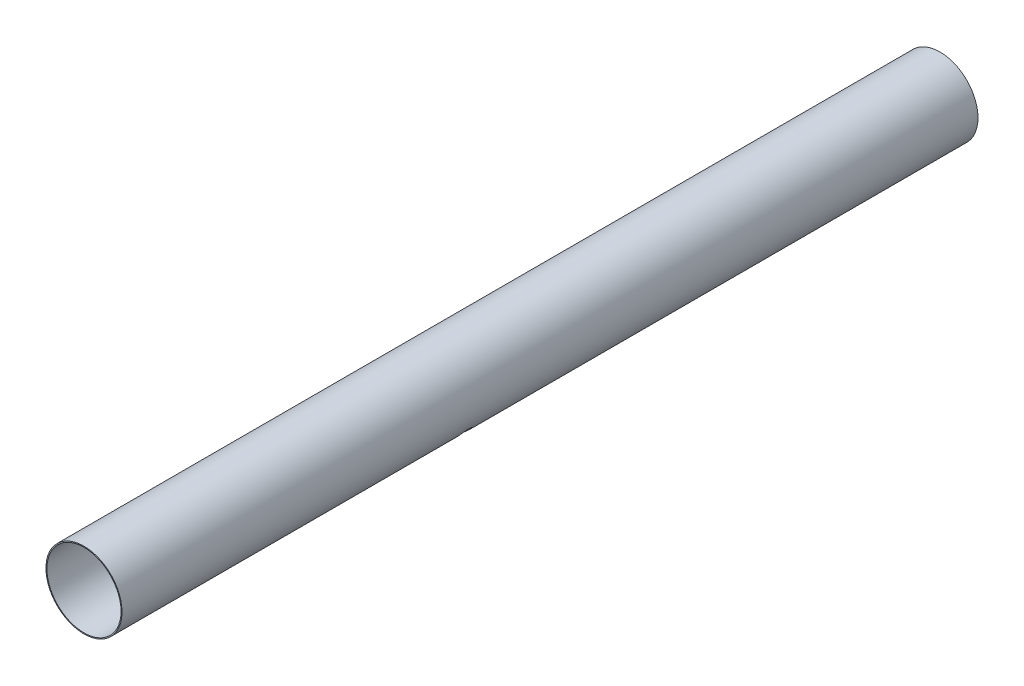
ISO-10303-21;
HEADER;
FILE_DESCRIPTION(('STEP AP214'),'2;1');
FILE_NAME('part.step','',(''),(''),'','','');
FILE_SCHEMA(('AUTOMOTIVE_DESIGN { 1 0 10303 214 1 1 1 1 }'));
ENDSEC;
DATA;
#1=APPLICATION_CONTEXT('core data for automotive mechanical design processes');
#2=APPLICATION_PROTOCOL_DEFINITION('international standard','automotive_design',2000,#1);
#3=PRODUCT_CONTEXT('',#1,'mechanical');
#4=PRODUCT('Part','Part','',(#3));
#5=PRODUCT_RELATED_PRODUCT_CATEGORY('part','',(#4));
#6=PRODUCT_DEFINITION_FORMATION('','',#4);
#7=PRODUCT_DEFINITION_CONTEXT('part definition',#1,'design');
#8=PRODUCT_DEFINITION('design','',#6,#7);
#9=PRODUCT_DEFINITION_SHAPE('','',#8);
#10=(LENGTH_UNIT() NAMED_UNIT(*) SI_UNIT(.MILLI.,.METRE.));
#11=(NAMED_UNIT(*) PLANE_ANGLE_UNIT() SI_UNIT($,.RADIAN.));
#12=(NAMED_UNIT(*) SI_UNIT($,.STERADIAN.) SOLID_ANGLE_UNIT());
#13=UNCERTAINTY_MEASURE_WITH_UNIT(LENGTH_MEASURE(1.E-05),#10,'distance_accuracy_value','');
#14=(GEOMETRIC_REPRESENTATION_CONTEXT(3) GLOBAL_UNCERTAINTY_ASSIGNED_CONTEXT((#13)) GLOBAL_UNIT_ASSIGNED_CONTEXT((#10,
#11,#12)) REPRESENTATION_CONTEXT('',''));
#15=CARTESIAN_POINT('',(0.,0.,0.));
#16=DIRECTION('',(0.,0.,1.));
#17=DIRECTION('',(1.,0.,0.));
#18=AXIS2_PLACEMENT_3D('',#15,#16,#17);
#19=CARTESIAN_POINT('',(0.,0.,1760.));
#20=DIRECTION('',(0.,0.,-1.));
#21=DIRECTION('',(-1.,0.,0.));
#22=AXIS2_PLACEMENT_3D('',#19,#20,#21);
#23=CYLINDRICAL_SURFACE('',#22,78.2);
#24=CARTESIAN_POINT('',(0.,0.,1760.));
#25=DIRECTION('',(0.,0.,1.));
#26=DIRECTION('',(1.,0.,0.));
#27=AXIS2_PLACEMENT_3D('',#24,#25,#26);
#28=CIRCLE('',#27,78.2);
#29=CARTESIAN_POINT('',(78.2,0.,1760.));
#30=VERTEX_POINT('',#29);
#31=EDGE_CURVE('E10',#30,#30,#28,.T.);
#32=ORIENTED_EDGE('',*,*,#31,.F.);
#33=EDGE_LOOP('',(#32));
#34=FACE_BOUND('',#33,.T.);
#35=CARTESIAN_POINT('',(0.,0.,0.));
#36=DIRECTION('',(0.,0.,1.));
#37=DIRECTION('',(1.,0.,0.));
#38=AXIS2_PLACEMENT_3D('',#35,#36,#37);
#39=CIRCLE('',#38,78.2);
#40=CARTESIAN_POINT('',(78.2,0.,0.));
#41=VERTEX_POINT('',#40);
#42=EDGE_CURVE('E44',#41,#41,#39,.T.);
#43=ORIENTED_EDGE('',*,*,#42,.T.);
#44=EDGE_LOOP('',(#43));
#45=FACE_BOUND('',#44,.T.);
#46=CARTESIAN_POINT('',(43.6623581027108,-64.8755615383069,1034.89));
#47=CARTESIAN_POINT('',(43.6623496807628,-64.87556417447,1034.47275989778));
#48=CARTESIAN_POINT('',(43.6770819087763,-64.8656586351443,1034.05561945035));
#49=CARTESIAN_POINT('',(43.7358255801968,-64.8260666382009,1033.22422388497));
#50=CARTESIAN_POINT('',(43.7798421979213,-64.796376684834,1032.80996929));
#51=CARTESIAN_POINT('',(43.8967091385557,-64.7172609974049,1031.98714969527));
#52=CARTESIAN_POINT('',(43.9695812414536,-64.6678203553632,1031.5785892351));
#53=CARTESIAN_POINT('',(44.1433288631546,-64.5493420995531,1030.77037992374));
#54=CARTESIAN_POINT('',(44.2442031969181,-64.4803053150804,1030.37073069621));
#55=CARTESIAN_POINT('',(44.4727348982092,-64.3228968775756,1029.58350136965));
#56=CARTESIAN_POINT('',(44.600366659882,-64.2345437061631,1029.19591013591));
#57=CARTESIAN_POINT('',(44.8811060225703,-64.038703881101,1028.43505287068));
#58=CARTESIAN_POINT('',(45.0342138689332,-63.9312170431841,1028.06178697721));
#59=CARTESIAN_POINT('',(45.3643028091055,-63.6974168228568,1027.33213686961));
#60=CARTESIAN_POINT('',(45.541281671805,-63.5711051997935,1026.97575108198));
#61=CARTESIAN_POINT('',(45.917351991572,-63.3000039166223,1026.28219422909));
#62=CARTESIAN_POINT('',(46.116443609249,-63.1552141223026,1025.94502330341));
#63=CARTESIAN_POINT('',(46.5372573270351,-62.8457847286794,1025.28830895425));
#64=CARTESIAN_POINT('',(46.7592165195771,-62.6809331012947,1024.96901731689));
#65=CARTESIAN_POINT('',(47.2216675217133,-62.3332798299509,1024.35453506863));
#66=CARTESIAN_POINT('',(47.4621594769671,-62.1504780449081,1024.05934464718));
#67=CARTESIAN_POINT('',(47.959452674743,-61.7675429799055,1023.49505433353));
#68=CARTESIAN_POINT('',(48.2162549853749,-61.5674085645779,1023.22595615294));
#69=CARTESIAN_POINT('',(48.7438242728239,-61.1505731261449,1022.71572949519));
#70=CARTESIAN_POINT('',(49.0145912810585,-60.9338720657676,1022.47460108095));
#71=CARTESIAN_POINT('',(49.5699053756379,-60.483000841797,1022.02019952035));
#72=CARTESIAN_POINT('',(49.8545454797172,-60.2487046368343,1021.80716500496));
#73=CARTESIAN_POINT('',(50.4330588808102,-59.7652795967825,1021.41280923167));
#74=CARTESIAN_POINT('',(50.7269322424603,-59.5161506578478,1021.23148819582));
#75=CARTESIAN_POINT('',(51.3213387834939,-59.0043555036575,1020.90194357551));
#76=CARTESIAN_POINT('',(51.6218715181804,-58.7416901907849,1020.75371778829));
#77=CARTESIAN_POINT('',(52.2270506277264,-58.2042860937136,1020.49150366963));
#78=CARTESIAN_POINT('',(52.53169694739,-57.9295474714026,1020.37751487928));
#79=CARTESIAN_POINT('',(53.1388484287782,-57.3730798417388,1020.18585414844));
#80=CARTESIAN_POINT('',(53.4413346503358,-57.0914762799271,1020.10775789659));
#81=CARTESIAN_POINT('',(54.0454375185253,-56.5199395580935,1019.9864817129));
#82=CARTESIAN_POINT('',(54.3470541714818,-56.2300064588248,1019.94330152645));
#83=CARTESIAN_POINT('',(54.9470733323842,-55.6438228900297,1019.89220700689));
#84=CARTESIAN_POINT('',(55.2454760893486,-55.3475729153242,1019.88428992163));
#85=CARTESIAN_POINT('',(55.8368841816495,-54.7508795561989,1019.90377845133));
#86=CARTESIAN_POINT('',(56.1298895555506,-54.4504362017681,1019.9311838138));
#87=CARTESIAN_POINT('',(56.7046409787313,-53.8515893965332,1020.02050363353));
#88=CARTESIAN_POINT('',(56.9864843344896,-53.5532109323121,1020.08196041228));
#89=CARTESIAN_POINT('',(57.5410847147586,-52.9568633689938,1020.23857779726));
#90=CARTESIAN_POINT('',(57.8138418319461,-52.6588942657511,1020.33373805962));
#91=CARTESIAN_POINT('',(58.3486331891633,-52.0656940459295,1020.55703602807));
#92=CARTESIAN_POINT('',(58.6106671633619,-51.7704629973683,1020.68517455115));
#93=CARTESIAN_POINT('',(59.1225461215398,-51.1851123233137,1020.97346865194));
#94=CARTESIAN_POINT('',(59.3723909958543,-50.8949927438228,1021.13362451764));
#95=CARTESIAN_POINT('',(59.8600367045149,-50.3205603579858,1021.48581361921));
#96=CARTESIAN_POINT('',(60.0977584452467,-50.0362915025469,1021.67802802847));
#97=CARTESIAN_POINT('',(60.5584539727404,-49.4777195961244,1022.09228797332));
#98=CARTESIAN_POINT('',(60.7814277254698,-49.2034165681387,1022.31433357776));
#99=CARTESIAN_POINT('',(61.2116924839857,-48.6671031083204,1022.78672657944));
#100=CARTESIAN_POINT('',(61.4189820871721,-48.4050937766808,1023.0370765029));
#101=CARTESIAN_POINT('',(61.8170520730078,-47.8956844365422,1023.56435594999));
#102=CARTESIAN_POINT('',(62.0078322705763,-47.6482845918344,1023.84128577153));
#103=CARTESIAN_POINT('',(62.3751335364172,-47.1664708051701,1024.42452098603));
#104=CARTESIAN_POINT('',(62.551376415579,-46.9323292073347,1024.73122670461));
#105=CARTESIAN_POINT('',(62.885525101432,-46.4836423275914,1025.3680715411));
#106=CARTESIAN_POINT('',(63.0434307021023,-46.2690972658581,1025.69821092223));
#107=CARTESIAN_POINT('',(63.3404112073374,-45.8617037977611,1026.37968196004));
#108=CARTESIAN_POINT('',(63.479485705892,-45.6688558592159,1026.73101407343));
#109=CARTESIAN_POINT('',(63.7383852049995,-45.3068184768503,1027.45246087399));
#110=CARTESIAN_POINT('',(63.8582102773678,-45.1376289447659,1027.82257549109));
#111=CARTESIAN_POINT('',(64.0784723679087,-44.8243921193247,1028.57973638643));
#112=CARTESIAN_POINT('',(64.1788728837374,-44.6803922096652,1028.96681289751));
#113=CARTESIAN_POINT('',(64.3597237984537,-44.4194908597153,1029.75452831024));
#114=CARTESIAN_POINT('',(64.4401741362848,-44.3025895023585,1030.1551672534));
#115=CARTESIAN_POINT('',(64.5808909992508,-44.0972111268771,1030.96709430306));
#116=CARTESIAN_POINT('',(64.6411594917881,-44.008731338145,1031.37838136733));
#117=CARTESIAN_POINT('',(64.7413526508136,-43.8612040873241,1032.20863977332));
#118=CARTESIAN_POINT('',(64.7812776165333,-43.8021561923239,1032.62761100192));
#119=CARTESIAN_POINT('',(64.8402030253023,-43.7148807600576,1033.46349275942));
#120=CARTESIAN_POINT('',(64.8595235266004,-43.6861818593776,1033.88033158609));
#121=CARTESIAN_POINT('',(64.878295844346,-43.6582983604818,1034.71543963088));
#122=CARTESIAN_POINT('',(64.8777478684865,-43.6591134537443,1035.133708834));
#123=CARTESIAN_POINT('',(64.8567855746268,-43.6902473469971,1035.96862623638));
#124=CARTESIAN_POINT('',(64.8363722258371,-43.7205647076028,1036.38527451373));
#125=CARTESIAN_POINT('',(64.7757369990457,-43.8103506439682,1037.21396115566));
#126=CARTESIAN_POINT('',(64.735515158247,-43.8698191649781,1037.6259995289));
#127=CARTESIAN_POINT('',(64.6358112956779,-44.01658417737,1038.43894998519));
#128=CARTESIAN_POINT('',(64.5765004272744,-44.1036332755727,1038.83992778759));
#129=CARTESIAN_POINT('',(64.4386833373251,-44.3047507057611,1039.63167193173));
#130=CARTESIAN_POINT('',(64.3601772616886,-44.4188188323656,1040.02243835107));
#131=CARTESIAN_POINT('',(64.1841746111753,-44.6727610255715,1040.79111910652));
#132=CARTESIAN_POINT('',(64.0866769238404,-44.8126366038522,1041.16903268823));
#133=CARTESIAN_POINT('',(63.8729557895324,-45.1167378844695,1041.90945330335));
#134=CARTESIAN_POINT('',(63.7567321105489,-45.2809638884999,1042.2719601458));
#135=CARTESIAN_POINT('',(63.5043651436858,-45.6342335864576,1042.98343352619));
#136=CARTESIAN_POINT('',(63.3679987322034,-45.8235524488748,1043.33218430782));
#137=CARTESIAN_POINT('',(63.0768080154148,-46.223559654435,1044.00911694176));
#138=CARTESIAN_POINT('',(62.9219835840321,-46.4342481435408,1044.33729865354));
#139=CARTESIAN_POINT('',(62.5943366308358,-46.8749869835518,1044.97093309118));
#140=CARTESIAN_POINT('',(62.4215126208906,-47.105038935047,1045.27638393417));
#141=CARTESIAN_POINT('',(62.0584426754033,-47.5823452797119,1045.86248668616));
#142=CARTESIAN_POINT('',(61.8681966055957,-47.8295998054521,1046.143138404));
#143=CARTESIAN_POINT('',(61.4681647678749,-48.342651821325,1046.68150533538));
#144=CARTESIAN_POINT('',(61.2581419883568,-48.6086610591357,1046.93884281606));
#145=CARTESIAN_POINT('',(60.8217165364081,-49.1536432435658,1047.42424645946));
#146=CARTESIAN_POINT('',(60.5953136899976,-49.4326163278685,1047.65231231121));
#147=CARTESIAN_POINT('',(60.1271365980598,-50.0010298722669,1048.0775125486));
#148=CARTESIAN_POINT('',(59.8853627555737,-50.2904700578201,1048.2746477448));
#149=CARTESIAN_POINT('',(59.3876202511187,-50.8772892565308,1048.6365232127));
#150=CARTESIAN_POINT('',(59.1316517226888,-51.1746681949893,1048.80126378908));
#151=CARTESIAN_POINT('',(58.6083171836306,-51.7731813540944,1049.09628602895));
#152=CARTESIAN_POINT('',(58.3410205319055,-52.0742864531199,1049.22674977037));
#153=CARTESIAN_POINT('',(57.7952947131388,-52.6793114865409,1049.45336914588));
#154=CARTESIAN_POINT('',(57.5168655687122,-52.9832314152172,1049.54952484966));
#155=CARTESIAN_POINT('',(56.9506509721043,-53.5913793372568,1049.70675407274));
#156=CARTESIAN_POINT('',(56.6628663869477,-53.8956072995551,1049.76783083327));
#157=CARTESIAN_POINT('',(56.0798569774786,-54.5019864392952,1049.85441982361));
#158=CARTESIAN_POINT('',(55.7846322438955,-54.8041376420049,1049.87993248689));
#159=CARTESIAN_POINT('',(55.1936321774001,-55.3992419410402,1049.89506413731));
#160=CARTESIAN_POINT('',(54.8979415415809,-55.6922648414889,1049.88525197855));
#161=CARTESIAN_POINT('',(54.3035501764956,-56.2719893048543,1049.83107331168));
#162=CARTESIAN_POINT('',(54.004849481666,-56.5586909399699,1049.78670719845));
#163=CARTESIAN_POINT('',(53.4066983308257,-57.123846842018,1049.66377211014));
#164=CARTESIAN_POINT('',(53.1072478864051,-57.4023012355981,1049.58520366058));
#165=CARTESIAN_POINT('',(52.5099253216726,-57.9492168451592,1049.394475532));
#166=CARTESIAN_POINT('',(52.2120532071426,-58.2176780245541,1049.28231573001));
#167=CARTESIAN_POINT('',(51.6208462643092,-58.7425245568245,1049.0255120382));
#168=CARTESIAN_POINT('',(51.3275037220065,-58.9989324333076,1048.8809319086));
#169=CARTESIAN_POINT('',(50.7471463834094,-59.498855756419,1048.56023704233));
#170=CARTESIAN_POINT('',(50.4601315679278,-59.7423712421433,1048.38412240128));
#171=CARTESIAN_POINT('',(49.8947870887509,-60.2153308933427,1048.00161833156));
#172=CARTESIAN_POINT('',(49.6164578807498,-60.4447743211286,1047.79522731764));
#173=CARTESIAN_POINT('',(49.0708407027146,-60.8885562121565,1047.35362402537));
#174=CARTESIAN_POINT('',(48.8035528652791,-61.1028944940189,1047.11841140103));
#175=CARTESIAN_POINT('',(48.2784167641175,-61.5186827183556,1046.6170527001));
#176=CARTESIAN_POINT('',(48.0207691604102,-61.7198922976563,1046.35049701484));
#177=CARTESIAN_POINT('',(47.521537124154,-62.105095931006,1045.79118787303));
#178=CARTESIAN_POINT('',(47.2799528888443,-62.2890897736774,1045.4984340949));
#179=CARTESIAN_POINT('',(46.8150330329687,-62.63926419132,1044.88864496948));
#180=CARTESIAN_POINT('',(46.5917017211354,-62.8054405632212,1044.57160392302));
#181=CARTESIAN_POINT('',(46.1654854046647,-63.1193950988157,1043.91544141525));
#182=CARTESIAN_POINT('',(45.9626002395961,-63.267173406872,1043.57632012723));
#183=CARTESIAN_POINT('',(45.5773952593778,-63.5452440841687,1042.87485679957));
#184=CARTESIAN_POINT('',(45.3952962834786,-63.6753510532811,1042.51231989159));
#185=CARTESIAN_POINT('',(45.0558804507993,-63.9159677243766,1041.76957393297));
#186=CARTESIAN_POINT('',(44.8985635403911,-64.0264774687678,1041.38936492057));
#187=CARTESIAN_POINT('',(44.6105221715988,-64.2275032684813,1040.614241541));
#188=CARTESIAN_POINT('',(44.4797760555662,-64.3180356124358,1040.21933946319));
#189=CARTESIAN_POINT('',(44.2461972651515,-64.4789428394425,1039.41749947526));
#190=CARTESIAN_POINT('',(44.1433590315812,-64.5493217371706,1039.01056398008));
#191=CARTESIAN_POINT('',(43.9253023298542,-64.6980137159585,1037.9942460231));
#192=CARTESIAN_POINT('',(43.8268931251101,-64.7645706369842,1037.37941562419));
#193=CARTESIAN_POINT('',(43.6954282819969,-64.8533419195137,1036.13964881678));
#194=CARTESIAN_POINT('',(43.6623707124717,-64.8755575913119,1035.51471270747));
#195=CARTESIAN_POINT('',(43.6623581027108,-64.8755615383069,1034.89));
#196=B_SPLINE_CURVE_WITH_KNOTS('',3,(#46,#47,#48,#49,#50,#51,#52,#53,#54,#55,#56,#57,#58,#59,
#60,#61,#62,#63,#64,#65,#66,#67,#68,#69,#70,#71,#72,#73,#74,#75,#76,#77,#78,#79,#80,#81,#82,#83,
#84,#85,#86,#87,#88,#89,#90,#91,#92,#93,#94,#95,#96,#97,#98,#99,#100,#101,#102,#103,#104,#105,
#106,#107,#108,#109,#110,#111,#112,#113,#114,#115,#116,#117,#118,#119,#120,#121,#122,#123,#124,
#125,#126,#127,#128,#129,#130,#131,#132,#133,#134,#135,#136,#137,#138,#139,#140,#141,#142,#143,
#144,#145,#146,#147,#148,#149,#150,#151,#152,#153,#154,#155,#156,#157,#158,#159,#160,#161,#162,
#163,#164,#165,#166,#167,#168,#169,#170,#171,#172,#173,#174,#175,#176,#177,#178,#179,#180,#181,
#182,#183,#184,#185,#186,#187,#188,#189,#190,#191,#192,#193,#194,#195),.UNSPECIFIED.,.T.,.F.,(4,
2,2,2,2,2,2,2,2,2,2,2,2,2,2,2,2,2,2,2,2,2,2,2,2,2,2,2,2,2,2,2,2,2,2,2,2,2,2,2,2,2,2,2,2,2,2,2,2,
2,2,2,2,2,2,2,2,2,2,2,2,2,2,2,2,2,2,2,2,2,2,2,2,2,4),(0.,1.25117149936257,2.50256412945604,
3.75490311096526,5.00718910222582,6.2582821287706,7.50938720466209,8.7603754266534,
10.0113727354171,11.2769767497305,12.5425907121662,13.808287640985,15.0739874174719,
16.349827023866,17.6256755636131,18.9014391604801,20.1771856561909,21.4374360552732,
22.6976772647814,23.9578201156509,25.217953959207,26.4615476288387,27.7051286103089,
28.9487404020101,30.192363380374,31.4432686703083,32.6941768467394,33.9451967573268,
35.1962306908084,36.467355049742,37.7384936884871,39.009659729405,40.2808210277645,
41.5543483535245,42.8278795768003,44.1012866152881,45.3746749227764,46.627981405705,
47.8812747873222,49.1345070251396,50.3877369092232,51.6300294511315,52.8723125502465,
54.114668439587,55.3570397225924,56.6143792778434,57.8717274217781,59.1291796007698,
60.3866414713038,61.6617736841494,62.9369194427065,64.212031779574,65.4871321226241,
66.755315563697,68.0234964286683,69.2915600969164,70.5596083091723,71.8073284713462,
73.0550343752136,74.302721108915,75.5504124100549,76.7956711012484,78.0409260159874,
79.2862461541115,80.5315812432464,81.7955197219148,83.0594737173906,84.3237252215949,
85.5879668050428,86.8645883599643,88.1412071522581,89.4167811717007,90.6921009128183,
92.5654726929795,94.4387891137403),.UNSPECIFIED.);
#197=CARTESIAN_POINT('',(43.6623581027108,-64.8755615383069,1034.89));
#198=VERTEX_POINT('',#197);
#199=EDGE_CURVE('E54',#198,#198,#196,.T.);
#200=ORIENTED_EDGE('',*,*,#199,.F.);
#201=EDGE_LOOP('',(#200));
#202=FACE_BOUND('',#201,.T.);
#203=ADVANCED_FACE('F31',(#34,#45,#202),#23,.T.);
#204=CARTESIAN_POINT('',(0.,0.,1760.));
#205=DIRECTION('',(0.,0.,-1.));
#206=DIRECTION('',(-1.,0.,0.));
#207=AXIS2_PLACEMENT_3D('',#204,#205,#206);
#208=CYLINDRICAL_SURFACE('',#207,76.2);
#209=CARTESIAN_POINT('',(0.,0.,0.));
#210=DIRECTION('',(0.,0.,1.));
#211=DIRECTION('',(1.,0.,0.));
#212=AXIS2_PLACEMENT_3D('',#209,#210,#211);
#213=CIRCLE('',#212,76.2);
#214=CARTESIAN_POINT('',(76.2,0.,0.));
#215=VERTEX_POINT('',#214);
#216=EDGE_CURVE('E51',#215,#215,#213,.T.);
#217=ORIENTED_EDGE('',*,*,#216,.F.);
#218=EDGE_LOOP('',(#217));
#219=FACE_BOUND('',#218,.T.);
#220=CARTESIAN_POINT('',(0.,0.,1760.));
#221=DIRECTION('',(0.,0.,1.));
#222=DIRECTION('',(1.,0.,0.));
#223=AXIS2_PLACEMENT_3D('',#220,#221,#222);
#224=CIRCLE('',#223,76.2);
#225=CARTESIAN_POINT('',(76.2,0.,1760.));
#226=VERTEX_POINT('',#225);
#227=EDGE_CURVE('E49',#226,#226,#224,.T.);
#228=ORIENTED_EDGE('',*,*,#227,.T.);
#229=EDGE_LOOP('',(#228));
#230=FACE_BOUND('',#229,.T.);
#231=CARTESIAN_POINT('',(42.2206639695343,-63.4338674051304,1034.89));
#232=CARTESIAN_POINT('',(42.2206551337441,-63.4338700710789,1034.47298396823));
#233=CARTESIAN_POINT('',(42.2354375400337,-63.4240409151696,1034.0560702946));
#234=CARTESIAN_POINT('',(42.2943782569194,-63.384753107115,1033.22512997744));
#235=CARTESIAN_POINT('',(42.338541621746,-63.3552910776426,1032.81110384302));
#236=CARTESIAN_POINT('',(42.4557907908649,-63.2767790730241,1031.98875051305));
#237=CARTESIAN_POINT('',(42.5288979119229,-63.2277146606898,1031.58042774795));
#238=CARTESIAN_POINT('',(42.7031928756535,-63.1101288383243,1030.77269221975));
#239=CARTESIAN_POINT('',(42.8043795665676,-63.0416082263384,1030.37327909192));
#240=CARTESIAN_POINT('',(43.0335955842406,-62.8853627610896,1029.58652709342));
#241=CARTESIAN_POINT('',(43.161598523514,-62.7976567827217,1029.19917678004));
#242=CARTESIAN_POINT('',(43.4431258837929,-62.603227226676,1028.43878879139));
#243=CARTESIAN_POINT('',(43.5966505421765,-62.4965034721126,1028.06575124929));
#244=CARTESIAN_POINT('',(43.9276039820411,-62.2643272003438,1027.33653341136));
#245=CARTESIAN_POINT('',(44.1050307235584,-62.1388762813411,1026.98035168044));
#246=CARTESIAN_POINT('',(44.4820112709666,-61.8695750059058,1026.28717176822));
#247=CARTESIAN_POINT('',(44.6815652502133,-61.7257245053201,1025.95017373724));
#248=CARTESIAN_POINT('',(45.1034392235677,-61.418146561159,1025.29356353835));
#249=CARTESIAN_POINT('',(45.3260089697463,-61.2541964669641,1024.97421608683));
#250=CARTESIAN_POINT('',(45.7896893928306,-60.9083571732621,1024.35960117202));
#251=CARTESIAN_POINT('',(46.0308002220734,-60.7264678263591,1024.06433390662));
#252=CARTESIAN_POINT('',(46.5293240793679,-60.3453430530656,1023.49986396426));
#253=CARTESIAN_POINT('',(46.7867382028561,-60.1461064607568,1023.23066304182));
#254=CARTESIAN_POINT('',(47.3155088792477,-59.7310268637411,1022.72020311753));
#255=CARTESIAN_POINT('',(47.5868654656309,-59.515183819157,1022.47894418279));
#256=CARTESIAN_POINT('',(48.1434504242458,-59.0658712791504,1022.02415190559));
#257=CARTESIAN_POINT('',(48.4287766897531,-58.8322681733289,1021.81087024977));
#258=CARTESIAN_POINT('',(49.0086189776314,-58.3501277979006,1021.41602293576));
#259=CARTESIAN_POINT('',(49.3031350678643,-58.1015904179997,1021.23445751184));
#260=CARTESIAN_POINT('',(49.8987655397072,-57.5908592751978,1020.90443369292));
#261=CARTESIAN_POINT('',(50.1998794571662,-57.3286664711677,1020.7559729772));
#262=CARTESIAN_POINT('',(50.8061437333288,-56.7920734460023,1020.49330493958));
#263=CARTESIAN_POINT('',(51.1112940349011,-56.5176733975196,1020.3790971334));
#264=CARTESIAN_POINT('',(51.7191627177076,-55.9619122709981,1020.18708447499));
#265=CARTESIAN_POINT('',(52.0218623675056,-55.6806848984606,1020.1088332232));
#266=CARTESIAN_POINT('',(52.626290223047,-55.1097666728942,1019.98723035295));
#267=CARTESIAN_POINT('',(52.9280184362252,-54.8200758848102,1019.94387846677));
#268=CARTESIAN_POINT('',(53.5281503234552,-54.2342414667681,1019.8924275068));
#269=CARTESIAN_POINT('',(53.8265542679813,-53.9380983676746,1019.88432554375));
#270=CARTESIAN_POINT('',(54.4178510094423,-53.3414836884508,1019.90343282485));
#271=CARTESIAN_POINT('',(54.7107438479163,-53.0410121409757,1019.93064180274));
#272=CARTESIAN_POINT('',(55.2849568272785,-52.442189677018,1020.01952898987));
#273=CARTESIAN_POINT('',(55.5663809638181,-52.1438668434683,1020.0807256247));
#274=CARTESIAN_POINT('',(56.1200485331912,-51.5475092020332,1020.23676327809));
#275=CARTESIAN_POINT('',(56.3922920646458,-51.2494743910872,1020.33160393511));
#276=CARTESIAN_POINT('',(56.9259728006462,-50.6560252053536,1020.55420297249));
#277=CARTESIAN_POINT('',(57.1874097282647,-50.3606108978705,1020.6819621958));
#278=CARTESIAN_POINT('',(57.698025301564,-49.7747815366119,1020.96943809291));
#279=CARTESIAN_POINT('',(57.9472038317375,-49.4843665299602,1021.12915506776));
#280=CARTESIAN_POINT('',(58.4335256665876,-48.909158698675,1021.48045208108));
#281=CARTESIAN_POINT('',(58.6705859480001,-48.6244111803176,1021.6722212085));
#282=CARTESIAN_POINT('',(59.1299186937928,-48.0647873174454,1022.08555028497));
#283=CARTESIAN_POINT('',(59.3521911227263,-47.7899109965929,1022.30711030543));
#284=CARTESIAN_POINT('',(59.7810362908824,-47.2523644716936,1022.77849727066));
#285=CARTESIAN_POINT('',(59.987607555197,-46.9896954152493,1023.02832686549));
#286=CARTESIAN_POINT('',(60.3842462316849,-46.4788919064326,1023.55453695886));
#287=CARTESIAN_POINT('',(60.5743134492207,-46.2307576254845,1023.83091777045));
#288=CARTESIAN_POINT('',(60.9403603471968,-45.747196682399,1024.41327135698));
#289=CARTESIAN_POINT('',(61.1160475384402,-45.5120557769189,1024.7196654221));
#290=CARTESIAN_POINT('',(61.4491081841066,-45.0613542434082,1025.35591620378));
#291=CARTESIAN_POINT('',(61.6064814221369,-44.8457938467423,1025.68577319751));
#292=CARTESIAN_POINT('',(61.9024426927744,-44.4363749462168,1026.3667168232));
#293=CARTESIAN_POINT('',(62.0410302839621,-44.2425169523325,1026.71780395376));
#294=CARTESIAN_POINT('',(62.2990212098391,-43.8784884579615,1027.43880491626));
#295=CARTESIAN_POINT('',(62.4184246184148,-43.7083178662451,1027.80871867569));
#296=CARTESIAN_POINT('',(62.6379455119637,-43.3931418807856,1028.5655963502));
#297=CARTESIAN_POINT('',(62.7380231161858,-43.2481885852704,1028.95259354004));
#298=CARTESIAN_POINT('',(62.9183193202124,-42.9854684490392,1029.74020943619));
#299=CARTESIAN_POINT('',(62.9985378549473,-42.8677016974021,1030.14082818714));
#300=CARTESIAN_POINT('',(63.1388936348137,-42.6607051459524,1030.95277102565));
#301=CARTESIAN_POINT('',(63.1990329506538,-42.5714724035545,1031.36409400459));
#302=CARTESIAN_POINT('',(63.2990794791076,-42.4225718096384,1032.19447844721));
#303=CARTESIAN_POINT('',(63.3389870064631,-42.3629034981924,1032.61353979039));
#304=CARTESIAN_POINT('',(63.3979696309242,-42.2745812417168,1033.44929967184));
#305=CARTESIAN_POINT('',(63.4173794444623,-42.2454290566654,1033.86592201827));
#306=CARTESIAN_POINT('',(63.4364793662329,-42.2167429781693,1034.70063406099));
#307=CARTESIAN_POINT('',(63.4361696913857,-42.2172087589182,1035.11872374107));
#308=CARTESIAN_POINT('',(63.4158323048546,-42.2477519617633,1035.95331571353));
#309=CARTESIAN_POINT('',(63.3958056079889,-42.2778278598522,1036.36981808651));
#310=CARTESIAN_POINT('',(63.3360882991893,-42.3672373637436,1037.19824549261));
#311=CARTESIAN_POINT('',(63.2963977272478,-42.4265709100419,1037.61017053505));
#312=CARTESIAN_POINT('',(63.1979156056028,-42.5731272979352,1038.42270661585));
#313=CARTESIAN_POINT('',(63.1393044520312,-42.6600866249315,1038.82338712216));
#314=CARTESIAN_POINT('',(63.003033119098,-42.8610842750021,1039.61458083433));
#315=CARTESIAN_POINT('',(62.9253730931523,-42.9751223799889,1040.00509412205));
#316=CARTESIAN_POINT('',(62.7511955905434,-43.2290543395301,1040.77332105079));
#317=CARTESIAN_POINT('',(62.6546769601814,-43.3689497759108,1041.15103390708));
#318=CARTESIAN_POINT('',(62.4430308452137,-43.6731291390486,1041.89111353882));
#319=CARTESIAN_POINT('',(62.3279031185629,-43.8374133830242,1042.25348011459));
#320=CARTESIAN_POINT('',(62.0777647146755,-44.1909332892738,1042.96495503044));
#321=CARTESIAN_POINT('',(61.9425209419233,-44.3804582968549,1043.31383766806));
#322=CARTESIAN_POINT('',(61.6536311393851,-44.7809189395688,1043.9910914528));
#323=CARTESIAN_POINT('',(61.4999849780283,-44.9918547277798,1044.31946245324));
#324=CARTESIAN_POINT('',(61.1747250664081,-45.4331170210964,1044.95354116178));
#325=CARTESIAN_POINT('',(61.0031097486126,-45.663445217547,1045.25924688872));
#326=CARTESIAN_POINT('',(60.6424618605117,-46.1413199522961,1045.84592920732));
#327=CARTESIAN_POINT('',(60.4534291479668,-46.3888666312057,1046.12690559699));
#328=CARTESIAN_POINT('',(60.0556591386034,-46.9027174611412,1046.66621611537));
#329=CARTESIAN_POINT('',(59.846670810889,-47.1692456550193,1046.92415181659));
#330=CARTESIAN_POINT('',(59.4122366016436,-47.7152789144254,1047.41078109941));
#331=CARTESIAN_POINT('',(59.1867905355751,-47.9947841254493,1047.63947435304));
#332=CARTESIAN_POINT('',(58.7204240765169,-48.5642586547127,1048.06595292828));
#333=CARTESIAN_POINT('',(58.4795041011247,-48.8542276904704,1048.2637390835));
#334=CARTESIAN_POINT('',(57.9833433983072,-49.4420853244401,1048.62693247608));
#335=CARTESIAN_POINT('',(57.7281028120249,-49.739973844583,1048.7923400325));
#336=CARTESIAN_POINT('',(57.2061274796212,-50.3394082101804,1049.08866969382));
#337=CARTESIAN_POINT('',(56.9394654483111,-50.6409240655139,1049.21978050989));
#338=CARTESIAN_POINT('',(56.3948547617213,-51.2467192605059,1049.44770456854));
#339=CARTESIAN_POINT('',(56.1169061298527,-51.5509985944314,1049.54451788227));
#340=CARTESIAN_POINT('',(55.5514893641646,-52.1597985669911,1049.70306285302));
#341=CARTESIAN_POINT('',(55.2640221614645,-52.4643191791953,1049.76479793078));
#342=CARTESIAN_POINT('',(54.6814777895215,-53.0712058373988,1049.85269627599));
#343=CARTESIAN_POINT('',(54.3864007184517,-53.373571911129,1049.87886000212));
#344=CARTESIAN_POINT('',(53.7957774435932,-53.9687607380047,1049.89526243015));
#345=CARTESIAN_POINT('',(53.5003232160454,-54.2616584292,1049.88610002323));
#346=CARTESIAN_POINT('',(52.9062477233888,-54.8410530903184,1049.8332622443));
#347=CARTESIAN_POINT('',(52.6076264964214,-55.1275501371982,1049.78958728749));
#348=CARTESIAN_POINT('',(52.0094792859335,-55.6922187569467,1049.6680724107));
#349=CARTESIAN_POINT('',(51.709953317593,-55.9703904686552,1049.59023306081));
#350=CARTESIAN_POINT('',(51.1123283775334,-56.5166682848227,1049.40099837859));
#351=CARTESIAN_POINT('',(50.8142294111996,-56.784774351322,1049.28960291973));
#352=CARTESIAN_POINT('',(50.2224853249569,-57.3087937231982,1049.03438578606));
#353=CARTESIAN_POINT('',(49.9288319870375,-57.5647320740373,1048.89063455225));
#354=CARTESIAN_POINT('',(49.3477125454912,-58.0636714680044,1048.57164052525));
#355=CARTESIAN_POINT('',(49.0602464216212,-58.3066725534634,1048.3963978351));
#356=CARTESIAN_POINT('',(48.4938643483203,-58.7785761847725,1048.01567540064));
#357=CARTESIAN_POINT('',(48.2149488809435,-59.007477936486,1047.81019395535));
#358=CARTESIAN_POINT('',(47.6680329762751,-59.4501676173977,1047.37044145976));
#359=CARTESIAN_POINT('',(47.4000326770305,-59.6639553554704,1047.13617004548));
#360=CARTESIAN_POINT('',(46.8731507934696,-60.0787976864118,1046.63654873991));
#361=CARTESIAN_POINT('',(46.6144779543996,-60.2796002025205,1046.3707693092));
#362=CARTESIAN_POINT('',(46.1131102051109,-60.6639998518935,1045.81298788403));
#363=CARTESIAN_POINT('',(45.870415497169,-60.847596767354,1045.52098555771));
#364=CARTESIAN_POINT('',(45.4032067559232,-61.1970093438047,1044.91266487537));
#365=CARTESIAN_POINT('',(45.1786970177387,-61.362820807019,1044.59634080898));
#366=CARTESIAN_POINT('',(44.7500757591189,-61.6760991608105,1043.94156623035));
#367=CARTESIAN_POINT('',(44.5459640899048,-61.8235661851897,1043.60311587954));
#368=CARTESIAN_POINT('',(44.1581487977911,-62.1011705038696,1042.90272784805));
#369=CARTESIAN_POINT('',(43.9746797071687,-62.2311114436498,1042.54058236461));
#370=CARTESIAN_POINT('',(43.6325529604274,-62.4714658527435,1041.79852830313));
#371=CARTESIAN_POINT('',(43.4738952454128,-62.5818793684102,1041.41861976725));
#372=CARTESIAN_POINT('',(43.1832293697416,-62.7827996818707,1040.6439945721));
#373=CARTESIAN_POINT('',(43.0511998821279,-62.8733224157402,1040.24929006605));
#374=CARTESIAN_POINT('',(42.8151418384262,-63.0343078517372,1039.44774606979));
#375=CARTESIAN_POINT('',(42.7111078028023,-63.1047744795923,1039.04090897162));
#376=CARTESIAN_POINT('',(42.489203052565,-63.2545150909982,1038.01993730336));
#377=CARTESIAN_POINT('',(42.3887057121777,-63.3217499504377,1037.40013226763));
#378=CARTESIAN_POINT('',(42.25444392871,-63.4114233660305,1036.15014006962));
#379=CARTESIAN_POINT('',(42.2206773170661,-63.4338633778923,1035.51995324538));
#380=CARTESIAN_POINT('',(42.2206639695343,-63.4338674051304,1034.89));
#381=B_SPLINE_CURVE_WITH_KNOTS('',3,(#231,#232,#233,#234,#235,#236,#237,#238,#239,#240,#241,
#242,#243,#244,#245,#246,#247,#248,#249,#250,#251,#252,#253,#254,#255,#256,#257,#258,#259,#260,
#261,#262,#263,#264,#265,#266,#267,#268,#269,#270,#271,#272,#273,#274,#275,#276,#277,#278,#279,
#280,#281,#282,#283,#284,#285,#286,#287,#288,#289,#290,#291,#292,#293,#294,#295,#296,#297,#298,
#299,#300,#301,#302,#303,#304,#305,#306,#307,#308,#309,#310,#311,#312,#313,#314,#315,#316,#317,
#318,#319,#320,#321,#322,#323,#324,#325,#326,#327,#328,#329,#330,#331,#332,#333,#334,#335,#336,
#337,#338,#339,#340,#341,#342,#343,#344,#345,#346,#347,#348,#349,#350,#351,#352,#353,#354,#355,
#356,#357,#358,#359,#360,#361,#362,#363,#364,#365,#366,#367,#368,#369,#370,#371,#372,#373,#374,
#375,#376,#377,#378,#379,#380),.UNSPECIFIED.,.T.,.F.,(4,2,2,2,2,2,2,2,2,2,2,2,2,2,2,2,2,2,2,2,2,
2,2,2,2,2,2,2,2,2,2,2,2,2,2,2,2,2,2,2,2,2,2,2,2,2,2,2,2,2,2,2,2,2,2,2,2,2,2,2,2,2,2,2,2,2,2,2,2,
2,2,2,2,2,4),(0.,1.25049446849802,2.50120410772414,3.75283659984463,5.00441776049933,
6.25477308797303,7.50514004568119,8.75540035623752,10.0056704626553,11.2713133330889,
12.5369666033926,13.8027050047418,15.0684464456177,16.3448905213898,17.6213440252533,
18.897708018309,20.1740539649009,21.4340949492544,22.6941262670811,23.9540543042925,
25.2139728411599,26.4564788411659,27.6989714895146,28.9414959579529,30.1840321320873,
31.4341754981644,32.6843218607536,33.934585512602,35.1848639071974,36.4562796085484,
37.7277103310874,38.9991709241591,40.2706266201834,41.5446786937558,42.8187349418002,
44.0926597596936,45.3665647587815,46.6193297911021,47.8720810426365,49.1247678195107,
50.377452048676,51.6185289885674,52.8595959333984,54.1007388258409,55.3418978628998,
56.5987575045389,57.8556261328287,59.1126044950315,60.369593123293,61.6452572922794,
62.9209357672373,64.1965798296552,65.4722113216099,66.7406687902842,68.0091236279975,
69.2774547482024,70.5457695141699,71.7926775987123,73.0395706832967,74.2864429621099,
75.5333199426723,76.7775081914161,78.0216923688921,79.2659465603422,80.5102164833131,
81.7739875113307,83.0377745351123,84.301859188375,85.5659346210187,86.8431673010828,
88.1203969492858,89.3965995464096,90.6725521710447,92.5616369778455,94.4506603936216),.UNSPECIFIED.);
#382=CARTESIAN_POINT('',(42.2206639695343,-63.4338674051304,1034.89));
#383=VERTEX_POINT('',#382);
#384=EDGE_CURVE('E35',#383,#383,#381,.T.);
#385=ORIENTED_EDGE('',*,*,#384,.T.);
#386=EDGE_LOOP('',(#385));
#387=FACE_BOUND('',#386,.T.);
#388=ADVANCED_FACE('F66',(#219,#230,#387),#208,.F.);
#389=CARTESIAN_POINT('',(0.,0.,1760.));
#390=DIRECTION('',(0.,0.,1.));
#391=DIRECTION('',(1.,0.,0.));
#392=AXIS2_PLACEMENT_3D('',#389,#390,#391);
#393=PLANE('',#392);
#394=ORIENTED_EDGE('',*,*,#31,.T.);
#395=EDGE_LOOP('',(#394));
#396=FACE_BOUND('',#395,.T.);
#397=ORIENTED_EDGE('',*,*,#227,.F.);
#398=EDGE_LOOP('',(#397));
#399=FACE_BOUND('',#398,.T.);
#400=ADVANCED_FACE('F71',(#396,#399),#393,.T.);
#401=CARTESIAN_POINT('',(0.,0.,0.));
#402=DIRECTION('',(0.,0.,1.));
#403=DIRECTION('',(1.,0.,0.));
#404=AXIS2_PLACEMENT_3D('',#401,#402,#403);
#405=PLANE('',#404);
#406=ORIENTED_EDGE('',*,*,#42,.F.);
#407=EDGE_LOOP('',(#406));
#408=FACE_BOUND('',#407,.T.);
#409=ORIENTED_EDGE('',*,*,#216,.T.);
#410=EDGE_LOOP('',(#409));
#411=FACE_BOUND('',#410,.T.);
#412=ADVANCED_FACE('F64',(#408,#411),#405,.F.);
#413=CARTESIAN_POINT('',(78.2000000000002,-78.1999999999999,1034.89));
#414=DIRECTION('',(-0.707106781186549,0.707106781186546,0.));
#415=DIRECTION('',(-0.707106781186546,-0.707106781186549,0.));
#416=AXIS2_PLACEMENT_3D('',#413,#414,#415);
#417=CYLINDRICAL_SURFACE('',#416,14.9999999999999);
#418=ORIENTED_EDGE('',*,*,#384,.F.);
#419=EDGE_LOOP('',(#418));
#420=FACE_BOUND('',#419,.T.);
#421=ORIENTED_EDGE('',*,*,#199,.T.);
#422=EDGE_LOOP('',(#421));
#423=FACE_BOUND('',#422,.T.);
#424=ADVANCED_FACE('F61',(#420,#423),#417,.F.);
#425=CLOSED_SHELL('',(#203,#388,#400,#412,#424));
#426=MANIFOLD_SOLID_BREP('B2',#425);
#427=ADVANCED_BREP_SHAPE_REPRESENTATION('',(#18,#426),#14);
#428=SHAPE_DEFINITION_REPRESENTATION(#9,#427);
ENDSEC;
END-ISO-10303-21;
